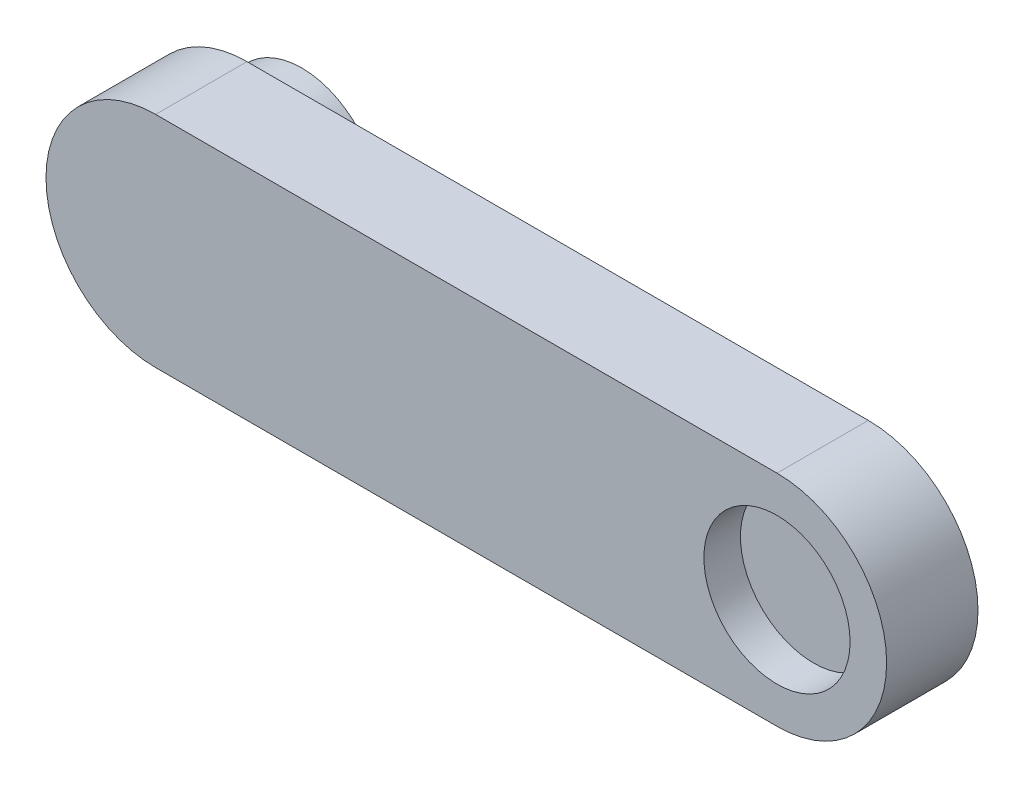
ISO-10303-21;
HEADER;
FILE_DESCRIPTION(('STEP AP214'),'2;1');
FILE_NAME('part.step','',(''),(''),'','','');
FILE_SCHEMA(('AUTOMOTIVE_DESIGN { 1 0 10303 214 1 1 1 1 }'));
ENDSEC;
DATA;
#1=APPLICATION_CONTEXT('core data for automotive mechanical design processes');
#2=APPLICATION_PROTOCOL_DEFINITION('international standard','automotive_design',2000,#1);
#3=PRODUCT_CONTEXT('',#1,'mechanical');
#4=PRODUCT('Part','Part','',(#3));
#5=PRODUCT_RELATED_PRODUCT_CATEGORY('part','',(#4));
#6=PRODUCT_DEFINITION_FORMATION('','',#4);
#7=PRODUCT_DEFINITION_CONTEXT('part definition',#1,'design');
#8=PRODUCT_DEFINITION('design','',#6,#7);
#9=PRODUCT_DEFINITION_SHAPE('','',#8);
#10=(LENGTH_UNIT() NAMED_UNIT(*) SI_UNIT(.MILLI.,.METRE.));
#11=(NAMED_UNIT(*) PLANE_ANGLE_UNIT() SI_UNIT($,.RADIAN.));
#12=(NAMED_UNIT(*) SI_UNIT($,.STERADIAN.) SOLID_ANGLE_UNIT());
#13=UNCERTAINTY_MEASURE_WITH_UNIT(LENGTH_MEASURE(1.E-05),#10,'distance_accuracy_value','');
#14=(GEOMETRIC_REPRESENTATION_CONTEXT(3) GLOBAL_UNCERTAINTY_ASSIGNED_CONTEXT((#13)) GLOBAL_UNIT_ASSIGNED_CONTEXT((#10,
#11,#12)) REPRESENTATION_CONTEXT('',''));
#15=CARTESIAN_POINT('',(0.,0.,0.));
#16=DIRECTION('',(0.,0.,1.));
#17=DIRECTION('',(1.,0.,0.));
#18=AXIS2_PLACEMENT_3D('',#15,#16,#17);
#19=CARTESIAN_POINT('',(-85.,0.,25.));
#20=DIRECTION('',(0.,0.,-1.));
#21=DIRECTION('',(-1.,0.,0.));
#22=AXIS2_PLACEMENT_3D('',#19,#20,#21);
#23=CYLINDRICAL_SURFACE('',#22,30.);
#24=CARTESIAN_POINT('',(-85.,0.,0.));
#25=DIRECTION('',(0.,0.,1.));
#26=DIRECTION('',(1.,0.,0.));
#27=AXIS2_PLACEMENT_3D('',#24,#25,#26);
#28=CIRCLE('',#27,30.);
#29=CARTESIAN_POINT('',(-85.,30.,0.));
#30=VERTEX_POINT('',#29);
#31=CARTESIAN_POINT('',(-85.,-30.,0.));
#32=VERTEX_POINT('',#31);
#33=EDGE_CURVE('E110',#30,#32,#28,.T.);
#34=ORIENTED_EDGE('',*,*,#33,.T.);
#35=DIRECTION('',(0.,0.,-1.));
#36=VECTOR('',#35,1.);
#37=CARTESIAN_POINT('',(-85.,-30.,25.));
#38=LINE('',#37,#36);
#39=CARTESIAN_POINT('',(-85.,-30.,25.));
#40=VERTEX_POINT('',#39);
#41=EDGE_CURVE('E48',#40,#32,#38,.T.);
#42=ORIENTED_EDGE('',*,*,#41,.F.);
#43=CARTESIAN_POINT('',(-85.,0.,25.));
#44=DIRECTION('',(0.,0.,1.));
#45=DIRECTION('',(1.,0.,0.));
#46=AXIS2_PLACEMENT_3D('',#43,#44,#45);
#47=CIRCLE('',#46,30.);
#48=CARTESIAN_POINT('',(-85.,30.,25.));
#49=VERTEX_POINT('',#48);
#50=EDGE_CURVE('E92',#49,#40,#47,.T.);
#51=ORIENTED_EDGE('',*,*,#50,.F.);
#52=DIRECTION('',(0.,0.,-1.));
#53=VECTOR('',#52,1.);
#54=CARTESIAN_POINT('',(-85.,30.,25.));
#55=LINE('',#54,#53);
#56=EDGE_CURVE('E106',#49,#30,#55,.T.);
#57=ORIENTED_EDGE('',*,*,#56,.T.);
#58=EDGE_LOOP('',(#34,#42,#51,#57));
#59=FACE_BOUND('',#58,.T.);
#60=ADVANCED_FACE('F39',(#59),#23,.T.);
#61=CARTESIAN_POINT('',(-85.,-30.,25.));
#62=DIRECTION('',(0.,1.,0.));
#63=DIRECTION('',(0.,0.,1.));
#64=AXIS2_PLACEMENT_3D('',#61,#62,#63);
#65=PLANE('',#64);
#66=DIRECTION('',(1.,0.,0.));
#67=VECTOR('',#66,1.);
#68=CARTESIAN_POINT('',(-85.,-30.,0.));
#69=LINE('',#68,#67);
#70=CARTESIAN_POINT('',(85.,-30.,0.));
#71=VERTEX_POINT('',#70);
#72=EDGE_CURVE('E98',#32,#71,#69,.T.);
#73=ORIENTED_EDGE('',*,*,#72,.T.);
#74=DIRECTION('',(0.,0.,-1.));
#75=VECTOR('',#74,1.);
#76=CARTESIAN_POINT('',(85.,-30.,25.));
#77=LINE('',#76,#75);
#78=CARTESIAN_POINT('',(85.,-30.,25.));
#79=VERTEX_POINT('',#78);
#80=EDGE_CURVE('E96',#79,#71,#77,.T.);
#81=ORIENTED_EDGE('',*,*,#80,.F.);
#82=DIRECTION('',(1.,0.,0.));
#83=VECTOR('',#82,1.);
#84=CARTESIAN_POINT('',(-85.,-30.,25.));
#85=LINE('',#84,#83);
#86=EDGE_CURVE('E87',#40,#79,#85,.T.);
#87=ORIENTED_EDGE('',*,*,#86,.F.);
#88=ORIENTED_EDGE('',*,*,#41,.T.);
#89=EDGE_LOOP('',(#73,#81,#87,#88));
#90=FACE_BOUND('',#89,.T.);
#91=ADVANCED_FACE('F97',(#90),#65,.F.);
#92=CARTESIAN_POINT('',(85.,0.,25.));
#93=DIRECTION('',(0.,0.,-1.));
#94=DIRECTION('',(-1.,0.,0.));
#95=AXIS2_PLACEMENT_3D('',#92,#93,#94);
#96=CYLINDRICAL_SURFACE('',#95,30.);
#97=CARTESIAN_POINT('',(85.,0.,0.));
#98=DIRECTION('',(0.,0.,1.));
#99=DIRECTION('',(1.,0.,0.));
#100=AXIS2_PLACEMENT_3D('',#97,#98,#99);
#101=CIRCLE('',#100,30.);
#102=CARTESIAN_POINT('',(85.,30.,0.));
#103=VERTEX_POINT('',#102);
#104=EDGE_CURVE('E73',#71,#103,#101,.T.);
#105=ORIENTED_EDGE('',*,*,#104,.T.);
#106=DIRECTION('',(0.,0.,-1.));
#107=VECTOR('',#106,1.);
#108=CARTESIAN_POINT('',(85.,30.,25.));
#109=LINE('',#108,#107);
#110=CARTESIAN_POINT('',(85.,30.,25.));
#111=VERTEX_POINT('',#110);
#112=EDGE_CURVE('E100',#111,#103,#109,.T.);
#113=ORIENTED_EDGE('',*,*,#112,.F.);
#114=CARTESIAN_POINT('',(85.,0.,25.));
#115=DIRECTION('',(0.,0.,1.));
#116=DIRECTION('',(1.,0.,0.));
#117=AXIS2_PLACEMENT_3D('',#114,#115,#116);
#118=CIRCLE('',#117,30.);
#119=EDGE_CURVE('E90',#79,#111,#118,.T.);
#120=ORIENTED_EDGE('',*,*,#119,.F.);
#121=ORIENTED_EDGE('',*,*,#80,.T.);
#122=EDGE_LOOP('',(#105,#113,#120,#121));
#123=FACE_BOUND('',#122,.T.);
#124=ADVANCED_FACE('F102',(#123),#96,.T.);
#125=CARTESIAN_POINT('',(-85.,30.,25.));
#126=DIRECTION('',(0.,-1.,0.));
#127=DIRECTION('',(0.,0.,-1.));
#128=AXIS2_PLACEMENT_3D('',#125,#126,#127);
#129=PLANE('',#128);
#130=DIRECTION('',(-1.,0.,0.));
#131=VECTOR('',#130,1.);
#132=CARTESIAN_POINT('',(-85.,30.,0.));
#133=LINE('',#132,#131);
#134=EDGE_CURVE('E79',#103,#30,#133,.T.);
#135=ORIENTED_EDGE('',*,*,#134,.T.);
#136=ORIENTED_EDGE('',*,*,#56,.F.);
#137=DIRECTION('',(-1.,0.,0.));
#138=VECTOR('',#137,1.);
#139=CARTESIAN_POINT('',(-85.,30.,25.));
#140=LINE('',#139,#138);
#141=EDGE_CURVE('E56',#111,#49,#140,.T.);
#142=ORIENTED_EDGE('',*,*,#141,.F.);
#143=ORIENTED_EDGE('',*,*,#112,.T.);
#144=EDGE_LOOP('',(#135,#136,#142,#143));
#145=FACE_BOUND('',#144,.T.);
#146=ADVANCED_FACE('F140',(#145),#129,.F.);
#147=CARTESIAN_POINT('',(-85.,0.,25.));
#148=DIRECTION('',(0.,0.,1.));
#149=DIRECTION('',(1.,0.,0.));
#150=AXIS2_PLACEMENT_3D('',#147,#148,#149);
#151=PLANE('',#150);
#152=CARTESIAN_POINT('',(85.,0.,25.));
#153=DIRECTION('',(0.,0.,1.));
#154=DIRECTION('',(1.,0.,0.));
#155=AXIS2_PLACEMENT_3D('',#152,#153,#154);
#156=CIRCLE('',#155,20.);
#157=CARTESIAN_POINT('',(105.,0.,25.));
#158=VERTEX_POINT('',#157);
#159=EDGE_CURVE('E202',#158,#158,#156,.T.);
#160=ORIENTED_EDGE('',*,*,#159,.F.);
#161=EDGE_LOOP('',(#160));
#162=FACE_BOUND('',#161,.T.);
#163=ORIENTED_EDGE('',*,*,#50,.T.);
#164=ORIENTED_EDGE('',*,*,#86,.T.);
#165=ORIENTED_EDGE('',*,*,#119,.T.);
#166=ORIENTED_EDGE('',*,*,#141,.T.);
#167=EDGE_LOOP('',(#163,#164,#165,#166));
#168=FACE_BOUND('',#167,.T.);
#169=ADVANCED_FACE('F88',(#162,#168),#151,.T.);
#170=CARTESIAN_POINT('',(-85.,0.,0.));
#171=DIRECTION('',(0.,0.,1.));
#172=DIRECTION('',(1.,0.,0.));
#173=AXIS2_PLACEMENT_3D('',#170,#171,#172);
#174=PLANE('',#173);
#175=CARTESIAN_POINT('',(-85.,0.,0.));
#176=DIRECTION('',(0.,0.,1.));
#177=DIRECTION('',(1.,0.,0.));
#178=AXIS2_PLACEMENT_3D('',#175,#176,#177);
#179=CIRCLE('',#178,21.);
#180=CARTESIAN_POINT('',(-64.,0.,0.));
#181=VERTEX_POINT('',#180);
#182=EDGE_CURVE('E11',#181,#181,#179,.F.);
#183=ORIENTED_EDGE('',*,*,#182,.F.);
#184=EDGE_LOOP('',(#183));
#185=FACE_BOUND('',#184,.T.);
#186=ORIENTED_EDGE('',*,*,#33,.F.);
#187=ORIENTED_EDGE('',*,*,#134,.F.);
#188=ORIENTED_EDGE('',*,*,#104,.F.);
#189=ORIENTED_EDGE('',*,*,#72,.F.);
#190=EDGE_LOOP('',(#186,#187,#188,#189));
#191=FACE_BOUND('',#190,.T.);
#192=ADVANCED_FACE('F128',(#185,#191),#174,.F.);
#193=CARTESIAN_POINT('',(-85.,0.,-15.));
#194=DIRECTION('',(0.,0.,1.));
#195=DIRECTION('',(1.,0.,0.));
#196=AXIS2_PLACEMENT_3D('',#193,#194,#195);
#197=CYLINDRICAL_SURFACE('',#196,21.);
#198=CARTESIAN_POINT('',(-85.,0.,-15.));
#199=DIRECTION('',(0.,0.,-1.));
#200=DIRECTION('',(-1.,0.,0.));
#201=AXIS2_PLACEMENT_3D('',#198,#199,#200);
#202=CIRCLE('',#201,21.);
#203=CARTESIAN_POINT('',(-106.,0.,-15.));
#204=VERTEX_POINT('',#203);
#205=EDGE_CURVE('E114',#204,#204,#202,.T.);
#206=ORIENTED_EDGE('',*,*,#205,.F.);
#207=EDGE_LOOP('',(#206));
#208=FACE_BOUND('',#207,.T.);
#209=ORIENTED_EDGE('',*,*,#182,.T.);
#210=EDGE_LOOP('',(#209));
#211=FACE_BOUND('',#210,.T.);
#212=ADVANCED_FACE('F130',(#208,#211),#197,.T.);
#213=CARTESIAN_POINT('',(-85.,0.,-15.));
#214=DIRECTION('',(0.,0.,-1.));
#215=DIRECTION('',(-1.,0.,0.));
#216=AXIS2_PLACEMENT_3D('',#213,#214,#215);
#217=PLANE('',#216);
#218=ORIENTED_EDGE('',*,*,#205,.T.);
#219=EDGE_LOOP('',(#218));
#220=FACE_BOUND('',#219,.T.);
#221=ADVANCED_FACE('F137',(#220),#217,.T.);
#222=CARTESIAN_POINT('',(85.,0.,15.));
#223=DIRECTION('',(0.,0.,1.));
#224=DIRECTION('',(1.,0.,0.));
#225=AXIS2_PLACEMENT_3D('',#222,#223,#224);
#226=CYLINDRICAL_SURFACE('',#225,20.);
#227=CARTESIAN_POINT('',(85.,0.,15.));
#228=DIRECTION('',(0.,0.,1.));
#229=DIRECTION('',(1.,0.,0.));
#230=AXIS2_PLACEMENT_3D('',#227,#228,#229);
#231=CIRCLE('',#230,20.);
#232=CARTESIAN_POINT('',(105.,0.,15.));
#233=VERTEX_POINT('',#232);
#234=EDGE_CURVE('E199',#233,#233,#231,.T.);
#235=ORIENTED_EDGE('',*,*,#234,.F.);
#236=EDGE_LOOP('',(#235));
#237=FACE_BOUND('',#236,.T.);
#238=ORIENTED_EDGE('',*,*,#159,.T.);
#239=EDGE_LOOP('',(#238));
#240=FACE_BOUND('',#239,.T.);
#241=ADVANCED_FACE('F173',(#237,#240),#226,.F.);
#242=CARTESIAN_POINT('',(85.,0.,15.));
#243=DIRECTION('',(0.,0.,1.));
#244=DIRECTION('',(1.,0.,0.));
#245=AXIS2_PLACEMENT_3D('',#242,#243,#244);
#246=PLANE('',#245);
#247=ORIENTED_EDGE('',*,*,#234,.T.);
#248=EDGE_LOOP('',(#247));
#249=FACE_BOUND('',#248,.T.);
#250=ADVANCED_FACE('F178',(#249),#246,.T.);
#251=CLOSED_SHELL('',(#60,#91,#124,#146,#169,#192,#212,#221,#241,#250));
#252=MANIFOLD_SOLID_BREP('B2',#251);
#253=ADVANCED_BREP_SHAPE_REPRESENTATION('',(#18,#252),#14);
#254=SHAPE_DEFINITION_REPRESENTATION(#9,#253);
ENDSEC;
END-ISO-10303-21;
